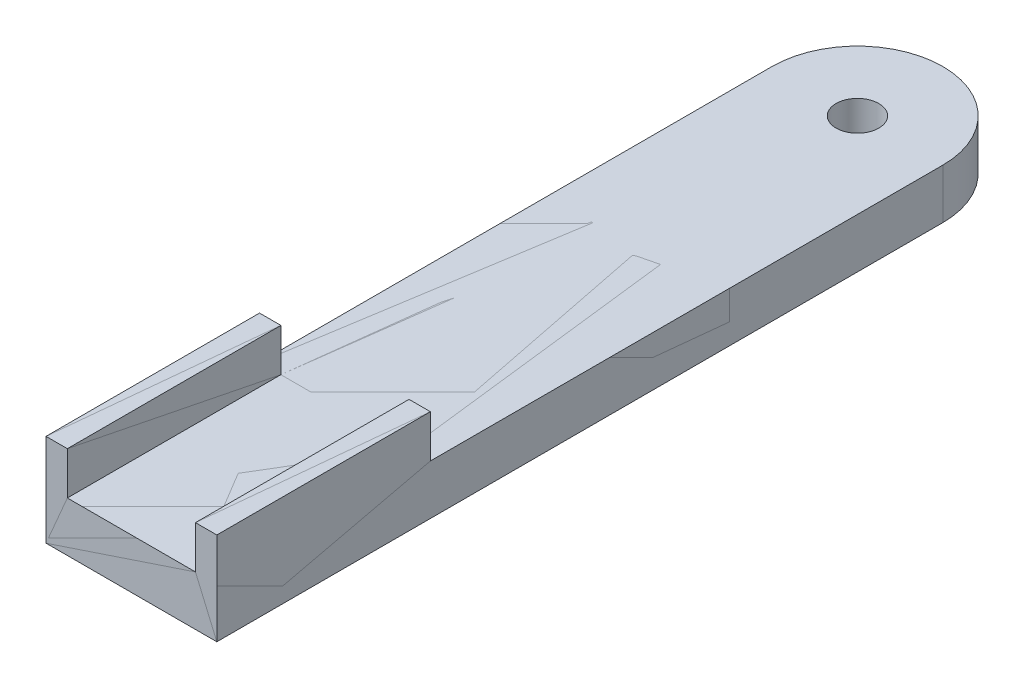
ISO-10303-21;
HEADER;
FILE_DESCRIPTION(('STEP AP214'),'2;1');
FILE_NAME('part.step','',(''),(''),'','','');
FILE_SCHEMA(('AUTOMOTIVE_DESIGN { 1 0 10303 214 1 1 1 1 }'));
ENDSEC;
DATA;
#1=APPLICATION_CONTEXT('core data for automotive mechanical design processes');
#2=APPLICATION_PROTOCOL_DEFINITION('international standard','automotive_design',2000,#1);
#3=PRODUCT_CONTEXT('',#1,'mechanical');
#4=PRODUCT('Part','Part','',(#3));
#5=PRODUCT_RELATED_PRODUCT_CATEGORY('part','',(#4));
#6=PRODUCT_DEFINITION_FORMATION('','',#4);
#7=PRODUCT_DEFINITION_CONTEXT('part definition',#1,'design');
#8=PRODUCT_DEFINITION('design','',#6,#7);
#9=PRODUCT_DEFINITION_SHAPE('','',#8);
#10=(LENGTH_UNIT() NAMED_UNIT(*) SI_UNIT(.MILLI.,.METRE.));
#11=(NAMED_UNIT(*) PLANE_ANGLE_UNIT() SI_UNIT($,.RADIAN.));
#12=(NAMED_UNIT(*) SI_UNIT($,.STERADIAN.) SOLID_ANGLE_UNIT());
#13=UNCERTAINTY_MEASURE_WITH_UNIT(LENGTH_MEASURE(1.E-05),#10,'distance_accuracy_value','');
#14=(GEOMETRIC_REPRESENTATION_CONTEXT(3) GLOBAL_UNCERTAINTY_ASSIGNED_CONTEXT((#13)) GLOBAL_UNIT_ASSIGNED_CONTEXT((#10,
#11,#12)) REPRESENTATION_CONTEXT('',''));
#15=CARTESIAN_POINT('',(0.,0.,0.));
#16=DIRECTION('',(0.,0.,1.));
#17=DIRECTION('',(1.,0.,0.));
#18=AXIS2_PLACEMENT_3D('',#15,#16,#17);
#19=CARTESIAN_POINT('',(0.,0.,-15.0000002235174));
#20=DIRECTION('',(0.,0.,-1.));
#21=DIRECTION('',(-1.,0.,0.));
#22=AXIS2_PLACEMENT_3D('',#19,#20,#21);
#23=PLANE('',#22);
#24=DIRECTION('',(1.,0.,0.));
#25=VECTOR('',#24,1.);
#26=CARTESIAN_POINT('',(12.,3.5,-15.0000002235174));
#27=LINE('',#26,#25);
#28=CARTESIAN_POINT('',(0.,3.5,-15.0000002235174));
#29=VERTEX_POINT('',#28);
#30=CARTESIAN_POINT('',(1.5,3.5,-15.0000002235174));
#31=VERTEX_POINT('',#30);
#32=EDGE_CURVE('P0_E56',#29,#31,#27,.T.);
#33=ORIENTED_EDGE('',*,*,#32,.F.);
#34=DIRECTION('',(0.,1.,0.));
#35=VECTOR('',#34,1.);
#36=CARTESIAN_POINT('',(0.,3.5,-15.0000002235174));
#37=LINE('',#36,#35);
#38=CARTESIAN_POINT('',(0.,6.5,-15.0000002235174));
#39=VERTEX_POINT('',#38);
#40=EDGE_CURVE('P0_E165',#29,#39,#37,.T.);
#41=ORIENTED_EDGE('',*,*,#40,.T.);
#42=DIRECTION('',(-1.,0.,0.));
#43=VECTOR('',#42,1.);
#44=CARTESIAN_POINT('',(0.,6.5,-15.0000002235174));
#45=LINE('',#44,#43);
#46=CARTESIAN_POINT('',(1.5,6.5,-15.0000002235174));
#47=VERTEX_POINT('',#46);
#48=EDGE_CURVE('P0_E161',#47,#39,#45,.T.);
#49=ORIENTED_EDGE('',*,*,#48,.F.);
#50=DIRECTION('',(0.,1.,0.));
#51=VECTOR('',#50,1.);
#52=CARTESIAN_POINT('',(1.5,3.5,-15.0000002235174));
#53=LINE('',#52,#51);
#54=EDGE_CURVE('P0_E166',#31,#47,#53,.T.);
#55=ORIENTED_EDGE('',*,*,#54,.F.);
#56=EDGE_LOOP('',(#33,#41,#49,#55));
#57=FACE_BOUND('',#56,.T.);
#58=ADVANCED_FACE('P0_F44',(#57),#23,.T.);
#59=CARTESIAN_POINT('',(10.5,3.5,-15.0000002235174));
#60=VERTEX_POINT('',#59);
#61=CARTESIAN_POINT('',(12.,3.5,-15.0000002235174));
#62=VERTEX_POINT('',#61);
#63=EDGE_CURVE('P0_E11',#60,#62,#27,.T.);
#64=ORIENTED_EDGE('',*,*,#63,.F.);
#65=DIRECTION('',(0.,1.,0.));
#66=VECTOR('',#65,1.);
#67=CARTESIAN_POINT('',(10.5,3.5,-15.0000002235174));
#68=LINE('',#67,#66);
#69=CARTESIAN_POINT('',(10.5,6.5,-15.0000002235174));
#70=VERTEX_POINT('',#69);
#71=EDGE_CURVE('P0_E197',#60,#70,#68,.T.);
#72=ORIENTED_EDGE('',*,*,#71,.T.);
#73=DIRECTION('',(-1.,0.,0.));
#74=VECTOR('',#73,1.);
#75=CARTESIAN_POINT('',(12.,6.5,-15.0000002235174));
#76=LINE('',#75,#74);
#77=CARTESIAN_POINT('',(12.,6.5,-15.0000002235174));
#78=VERTEX_POINT('',#77);
#79=EDGE_CURVE('P0_E190',#78,#70,#76,.T.);
#80=ORIENTED_EDGE('',*,*,#79,.F.);
#81=DIRECTION('',(0.,1.,0.));
#82=VECTOR('',#81,1.);
#83=CARTESIAN_POINT('',(12.,3.5,-15.0000002235174));
#84=LINE('',#83,#82);
#85=EDGE_CURVE('P0_E186',#62,#78,#84,.T.);
#86=ORIENTED_EDGE('',*,*,#85,.F.);
#87=EDGE_LOOP('',(#64,#72,#80,#86));
#88=FACE_BOUND('',#87,.T.);
#89=ADVANCED_FACE('P0_F268',(#88),#23,.T.);
#90=CARTESIAN_POINT('',(0.,0.,-36.0000005364418));
#91=DIRECTION('',(-1.,0.,0.));
#92=DIRECTION('',(0.,0.,1.));
#93=AXIS2_PLACEMENT_3D('',#90,#91,#92);
#94=PLANE('',#93);
#95=ORIENTED_EDGE('',*,*,#40,.F.);
#96=DIRECTION('',(0.,0.,-1.));
#97=VECTOR('',#96,1.);
#98=CARTESIAN_POINT('',(0.,3.5,0.00199999999999853));
#99=LINE('',#98,#97);
#100=CARTESIAN_POINT('',(0.,3.5,-51.0000005364418));
#101=VERTEX_POINT('',#100);
#102=EDGE_CURVE('P0_E152',#29,#101,#99,.T.);
#103=ORIENTED_EDGE('',*,*,#102,.T.);
#104=DIRECTION('',(0.,1.,0.));
#105=VECTOR('',#104,1.);
#106=CARTESIAN_POINT('',(0.,0.,-51.0000005364418));
#107=LINE('',#106,#105);
#108=CARTESIAN_POINT('',(0.,0.,-51.0000005364418));
#109=VERTEX_POINT('',#108);
#110=EDGE_CURVE('P0_E140',#109,#101,#107,.T.);
#111=ORIENTED_EDGE('',*,*,#110,.F.);
#112=DIRECTION('',(0.,0.,-1.));
#113=VECTOR('',#112,1.);
#114=CARTESIAN_POINT('',(0.,0.,0.));
#115=LINE('',#114,#113);
#116=CARTESIAN_POINT('',(0.,0.,0.));
#117=VERTEX_POINT('',#116);
#118=EDGE_CURVE('P0_E48',#117,#109,#115,.T.);
#119=ORIENTED_EDGE('',*,*,#118,.F.);
#120=DIRECTION('',(0.,1.,0.));
#121=VECTOR('',#120,1.);
#122=CARTESIAN_POINT('',(0.,0.,0.));
#123=LINE('',#122,#121);
#124=CARTESIAN_POINT('',(0.,6.5,0.));
#125=VERTEX_POINT('',#124);
#126=EDGE_CURVE('P0_E172',#117,#125,#123,.T.);
#127=ORIENTED_EDGE('',*,*,#126,.T.);
#128=DIRECTION('',(0.,0.,1.));
#129=VECTOR('',#128,1.);
#130=CARTESIAN_POINT('',(0.,6.5,0.));
#131=LINE('',#130,#129);
#132=EDGE_CURVE('P0_E176',#39,#125,#131,.T.);
#133=ORIENTED_EDGE('',*,*,#132,.F.);
#134=EDGE_LOOP('',(#95,#103,#111,#119,#127,#133));
#135=FACE_BOUND('',#134,.T.);
#136=ADVANCED_FACE('P0_F270',(#135),#94,.T.);
#137=CARTESIAN_POINT('',(0.75,6.5,-7.50000011175871));
#138=DIRECTION('',(0.,1.,0.));
#139=DIRECTION('',(1.,0.,0.));
#140=AXIS2_PLACEMENT_3D('',#137,#138,#139);
#141=PLANE('',#140);
#142=ORIENTED_EDGE('',*,*,#132,.T.);
#143=DIRECTION('',(1.,0.,0.));
#144=VECTOR('',#143,1.);
#145=CARTESIAN_POINT('',(0.,6.5,0.));
#146=LINE('',#145,#144);
#147=CARTESIAN_POINT('',(1.5,6.5,0.));
#148=VERTEX_POINT('',#147);
#149=EDGE_CURVE('P0_E181',#125,#148,#146,.T.);
#150=ORIENTED_EDGE('',*,*,#149,.T.);
#151=DIRECTION('',(0.,0.,-1.));
#152=VECTOR('',#151,1.);
#153=CARTESIAN_POINT('',(1.5,6.5,-15.0000002235174));
#154=LINE('',#153,#152);
#155=EDGE_CURVE('P0_E194',#148,#47,#154,.T.);
#156=ORIENTED_EDGE('',*,*,#155,.T.);
#157=ORIENTED_EDGE('',*,*,#48,.T.);
#158=EDGE_LOOP('',(#142,#150,#156,#157));
#159=FACE_BOUND('',#158,.T.);
#160=ADVANCED_FACE('P0_F278',(#159),#141,.T.);
#161=CARTESIAN_POINT('',(1.5,3.5,0.));
#162=DIRECTION('',(1.,0.,0.));
#163=DIRECTION('',(0.,1.,0.));
#164=AXIS2_PLACEMENT_3D('',#161,#162,#163);
#165=PLANE('',#164);
#166=DIRECTION('',(0.,0.,1.));
#167=VECTOR('',#166,1.);
#168=CARTESIAN_POINT('',(1.5,3.5,-10.5000001341105));
#169=LINE('',#168,#167);
#170=CARTESIAN_POINT('',(1.5,3.5,0.));
#171=VERTEX_POINT('',#170);
#172=EDGE_CURVE('P0_E206',#31,#171,#169,.T.);
#173=ORIENTED_EDGE('',*,*,#172,.F.);
#174=ORIENTED_EDGE('',*,*,#54,.T.);
#175=ORIENTED_EDGE('',*,*,#155,.F.);
#176=DIRECTION('',(0.,1.,0.));
#177=VECTOR('',#176,1.);
#178=CARTESIAN_POINT('',(1.5,3.5,0.));
#179=LINE('',#178,#177);
#180=EDGE_CURVE('P0_E180',#171,#148,#179,.T.);
#181=ORIENTED_EDGE('',*,*,#180,.F.);
#182=EDGE_LOOP('',(#173,#174,#175,#181));
#183=FACE_BOUND('',#182,.T.);
#184=ADVANCED_FACE('P0_F284',(#183),#165,.T.);
#185=CARTESIAN_POINT('',(11.25,6.5,-7.50000011175871));
#186=DIRECTION('',(0.,1.,0.));
#187=DIRECTION('',(1.,0.,0.));
#188=AXIS2_PLACEMENT_3D('',#185,#186,#187);
#189=PLANE('',#188);
#190=ORIENTED_EDGE('',*,*,#79,.T.);
#191=DIRECTION('',(0.,0.,1.));
#192=VECTOR('',#191,1.);
#193=CARTESIAN_POINT('',(10.5,6.5,-15.0000002235174));
#194=LINE('',#193,#192);
#195=CARTESIAN_POINT('',(10.5,6.5,0.));
#196=VERTEX_POINT('',#195);
#197=EDGE_CURVE('P0_E171',#70,#196,#194,.T.);
#198=ORIENTED_EDGE('',*,*,#197,.T.);
#199=DIRECTION('',(1.,0.,0.));
#200=VECTOR('',#199,1.);
#201=CARTESIAN_POINT('',(12.,6.5,0.));
#202=LINE('',#201,#200);
#203=CARTESIAN_POINT('',(12.,6.5,0.));
#204=VERTEX_POINT('',#203);
#205=EDGE_CURVE('P0_E182',#196,#204,#202,.T.);
#206=ORIENTED_EDGE('',*,*,#205,.T.);
#207=DIRECTION('',(0.,0.,-1.));
#208=VECTOR('',#207,1.);
#209=CARTESIAN_POINT('',(12.,6.5,0.));
#210=LINE('',#209,#208);
#211=EDGE_CURVE('P0_E187',#204,#78,#210,.T.);
#212=ORIENTED_EDGE('',*,*,#211,.T.);
#213=EDGE_LOOP('',(#190,#198,#206,#212));
#214=FACE_BOUND('',#213,.T.);
#215=ADVANCED_FACE('P0_F264',(#214),#189,.T.);
#216=CARTESIAN_POINT('',(0.,0.,0.));
#217=DIRECTION('',(0.,0.,1.));
#218=DIRECTION('',(1.,0.,0.));
#219=AXIS2_PLACEMENT_3D('',#216,#217,#218);
#220=PLANE('',#219);
#221=DIRECTION('',(1.,0.,0.));
#222=VECTOR('',#221,1.);
#223=CARTESIAN_POINT('',(0.,0.,0.));
#224=LINE('',#223,#222);
#225=CARTESIAN_POINT('',(12.,0.,0.));
#226=VERTEX_POINT('',#225);
#227=EDGE_CURVE('P0_E160',#117,#226,#224,.T.);
#228=ORIENTED_EDGE('',*,*,#227,.T.);
#229=DIRECTION('',(0.,1.,0.));
#230=VECTOR('',#229,1.);
#231=CARTESIAN_POINT('',(12.,0.,0.));
#232=LINE('',#231,#230);
#233=EDGE_CURVE('P0_E209',#226,#204,#232,.T.);
#234=ORIENTED_EDGE('',*,*,#233,.T.);
#235=ORIENTED_EDGE('',*,*,#205,.F.);
#236=DIRECTION('',(0.,1.,0.));
#237=VECTOR('',#236,1.);
#238=CARTESIAN_POINT('',(10.5,3.5,0.));
#239=LINE('',#238,#237);
#240=CARTESIAN_POINT('',(10.5,3.5,0.));
#241=VERTEX_POINT('',#240);
#242=EDGE_CURVE('P0_E167',#241,#196,#239,.T.);
#243=ORIENTED_EDGE('',*,*,#242,.F.);
#244=DIRECTION('',(1.,0.,0.));
#245=VECTOR('',#244,1.);
#246=CARTESIAN_POINT('',(0.,3.5,0.));
#247=LINE('',#246,#245);
#248=EDGE_CURVE('P0_E70',#171,#241,#247,.T.);
#249=ORIENTED_EDGE('',*,*,#248,.F.);
#250=ORIENTED_EDGE('',*,*,#180,.T.);
#251=ORIENTED_EDGE('',*,*,#149,.F.);
#252=ORIENTED_EDGE('',*,*,#126,.F.);
#253=EDGE_LOOP('',(#228,#234,#235,#243,#249,#250,#251,#252));
#254=FACE_BOUND('',#253,.T.);
#255=ADVANCED_FACE('P0_F257',(#254),#220,.T.);
#256=CARTESIAN_POINT('',(6.,3.5,-21.0000002682209));
#257=DIRECTION('',(0.,1.,0.));
#258=DIRECTION('',(1.,0.,0.));
#259=AXIS2_PLACEMENT_3D('',#256,#257,#258);
#260=PLANE('',#259);
#261=DIRECTION('',(0.,0.,-1.));
#262=VECTOR('',#261,1.);
#263=CARTESIAN_POINT('',(10.5,3.5,-18.0000002458692));
#264=LINE('',#263,#262);
#265=EDGE_CURVE('P0_E54',#241,#60,#264,.T.);
#266=ORIENTED_EDGE('',*,*,#265,.T.);
#267=ORIENTED_EDGE('',*,*,#63,.T.);
#268=DIRECTION('',(0.,0.,-1.));
#269=VECTOR('',#268,1.);
#270=CARTESIAN_POINT('',(12.,3.5,0.00199999999999853));
#271=LINE('',#270,#269);
#272=CARTESIAN_POINT('',(12.,3.5,-51.0000005364418));
#273=VERTEX_POINT('',#272);
#274=EDGE_CURVE('P0_E155',#62,#273,#271,.T.);
#275=ORIENTED_EDGE('',*,*,#274,.T.);
#276=CARTESIAN_POINT('',(6.,3.5,-51.0000005364418));
#277=DIRECTION('',(0.,1.,0.));
#278=DIRECTION('',(1.,0.,0.));
#279=AXIS2_PLACEMENT_3D('',#276,#277,#278);
#280=CIRCLE('',#279,6.);
#281=EDGE_CURVE('P0_E244',#273,#101,#280,.T.);
#282=ORIENTED_EDGE('',*,*,#281,.T.);
#283=ORIENTED_EDGE('',*,*,#102,.F.);
#284=ORIENTED_EDGE('',*,*,#32,.T.);
#285=ORIENTED_EDGE('',*,*,#172,.T.);
#286=ORIENTED_EDGE('',*,*,#248,.T.);
#287=EDGE_LOOP('',(#266,#267,#275,#282,#283,#284,#285,#286));
#288=FACE_BOUND('',#287,.T.);
#289=CARTESIAN_POINT('',(6.,3.5,-51.0000005364418));
#290=DIRECTION('',(0.,-1.,0.));
#291=DIRECTION('',(1.,0.,0.));
#292=AXIS2_PLACEMENT_3D('',#289,#290,#291);
#293=CIRCLE('',#292,1.5);
#294=CARTESIAN_POINT('',(4.5,3.5,-51.0000005364418));
#295=VERTEX_POINT('',#294);
#296=EDGE_CURVE('P0_E147',#295,#295,#293,.T.);
#297=ORIENTED_EDGE('',*,*,#296,.T.);
#298=EDGE_LOOP('',(#297));
#299=FACE_BOUND('',#298,.T.);
#300=ADVANCED_FACE('P0_F46',(#288,#299),#260,.T.);
#301=CARTESIAN_POINT('',(10.5,3.5,-15.0000002235174));
#302=DIRECTION('',(-1.,0.,0.));
#303=DIRECTION('',(0.,0.,1.));
#304=AXIS2_PLACEMENT_3D('',#301,#302,#303);
#305=PLANE('',#304);
#306=ORIENTED_EDGE('',*,*,#265,.F.);
#307=ORIENTED_EDGE('',*,*,#242,.T.);
#308=ORIENTED_EDGE('',*,*,#197,.F.);
#309=ORIENTED_EDGE('',*,*,#71,.F.);
#310=EDGE_LOOP('',(#306,#307,#308,#309));
#311=FACE_BOUND('',#310,.T.);
#312=ADVANCED_FACE('P0_F256',(#311),#305,.T.);
#313=CARTESIAN_POINT('',(6.,0.,-21.0000002682209));
#314=DIRECTION('',(0.,1.,0.));
#315=DIRECTION('',(1.,0.,0.));
#316=AXIS2_PLACEMENT_3D('',#313,#314,#315);
#317=PLANE('',#316);
#318=ORIENTED_EDGE('',*,*,#118,.T.);
#319=CARTESIAN_POINT('',(6.,0.,-51.0000005364418));
#320=DIRECTION('',(0.,1.,0.));
#321=DIRECTION('',(1.,0.,0.));
#322=AXIS2_PLACEMENT_3D('',#319,#320,#321);
#323=CIRCLE('',#322,6.);
#324=CARTESIAN_POINT('',(12.,0.,-51.0000005364418));
#325=VERTEX_POINT('',#324);
#326=EDGE_CURVE('P0_E145',#325,#109,#323,.T.);
#327=ORIENTED_EDGE('',*,*,#326,.F.);
#328=DIRECTION('',(0.,0.,-1.));
#329=VECTOR('',#328,1.);
#330=CARTESIAN_POINT('',(12.,0.,0.));
#331=LINE('',#330,#329);
#332=EDGE_CURVE('P0_E175',#226,#325,#331,.T.);
#333=ORIENTED_EDGE('',*,*,#332,.F.);
#334=ORIENTED_EDGE('',*,*,#227,.F.);
#335=EDGE_LOOP('',(#318,#327,#333,#334));
#336=FACE_BOUND('',#335,.T.);
#337=CARTESIAN_POINT('',(6.,0.,-51.0000005364418));
#338=DIRECTION('',(0.,-1.,0.));
#339=DIRECTION('',(1.,0.,0.));
#340=AXIS2_PLACEMENT_3D('',#337,#338,#339);
#341=CIRCLE('',#340,1.5);
#342=CARTESIAN_POINT('',(4.5,0.,-51.0000005364418));
#343=VERTEX_POINT('',#342);
#344=EDGE_CURVE('P0_E133',#343,#343,#341,.T.);
#345=ORIENTED_EDGE('',*,*,#344,.F.);
#346=EDGE_LOOP('',(#345));
#347=FACE_BOUND('',#346,.T.);
#348=ADVANCED_FACE('P0_F247',(#336,#347),#317,.F.);
#349=CARTESIAN_POINT('',(12.,0.,0.));
#350=DIRECTION('',(1.,0.,0.));
#351=DIRECTION('',(0.,0.,1.));
#352=AXIS2_PLACEMENT_3D('',#349,#350,#351);
#353=PLANE('',#352);
#354=ORIENTED_EDGE('',*,*,#332,.T.);
#355=DIRECTION('',(0.,1.,0.));
#356=VECTOR('',#355,1.);
#357=CARTESIAN_POINT('',(12.,0.,-51.0000005364418));
#358=LINE('',#357,#356);
#359=EDGE_CURVE('P0_E156',#325,#273,#358,.T.);
#360=ORIENTED_EDGE('',*,*,#359,.T.);
#361=ORIENTED_EDGE('',*,*,#274,.F.);
#362=ORIENTED_EDGE('',*,*,#85,.T.);
#363=ORIENTED_EDGE('',*,*,#211,.F.);
#364=ORIENTED_EDGE('',*,*,#233,.F.);
#365=EDGE_LOOP('',(#354,#360,#361,#362,#363,#364));
#366=FACE_BOUND('',#365,.T.);
#367=ADVANCED_FACE('P0_F233',(#366),#353,.T.);
#368=CARTESIAN_POINT('',(6.,0.,-51.0000005364418));
#369=DIRECTION('',(0.,1.,0.));
#370=DIRECTION('',(1.,0.,0.));
#371=AXIS2_PLACEMENT_3D('',#368,#369,#370);
#372=CYLINDRICAL_SURFACE('',#371,1.5);
#373=ORIENTED_EDGE('',*,*,#296,.F.);
#374=DIRECTION('',(0.,-1.,0.));
#375=VECTOR('',#374,1.);
#376=CARTESIAN_POINT('',(4.5,0.,-51.0000005364418));
#377=LINE('',#376,#375);
#378=EDGE_CURVE('P0_E136',#295,#343,#377,.T.);
#379=ORIENTED_EDGE('',*,*,#378,.T.);
#380=ORIENTED_EDGE('',*,*,#344,.T.);
#381=ORIENTED_EDGE('',*,*,#378,.F.);
#382=EDGE_LOOP('',(#373,#379,#380,#381));
#383=FACE_BOUND('',#382,.T.);
#384=ADVANCED_FACE('P0_F135',(#383),#372,.F.);
#385=CARTESIAN_POINT('',(6.,0.,-51.0000005364418));
#386=DIRECTION('',(0.,1.,0.));
#387=DIRECTION('',(1.,0.,0.));
#388=AXIS2_PLACEMENT_3D('',#385,#386,#387);
#389=CYLINDRICAL_SURFACE('',#388,6.);
#390=ORIENTED_EDGE('',*,*,#326,.T.);
#391=ORIENTED_EDGE('',*,*,#110,.T.);
#392=ORIENTED_EDGE('',*,*,#281,.F.);
#393=ORIENTED_EDGE('',*,*,#359,.F.);
#394=EDGE_LOOP('',(#390,#391,#392,#393));
#395=FACE_BOUND('',#394,.T.);
#396=ADVANCED_FACE('P0_F241',(#395),#389,.T.);
#397=CLOSED_SHELL('',(#58,#89,#136,#160,#184,#215,#255,#300,#312,#348,#367,#384,#396));
#398=MANIFOLD_SOLID_BREP('P0_B2',#397);
#399=CARTESIAN_POINT('',(6.,0.,-21.0000002682209));
#400=DIRECTION('',(0.,1.,0.));
#401=DIRECTION('',(1.,0.,0.));
#402=AXIS2_PLACEMENT_3D('',#399,#400,#401);
#403=PLANE('',#402);
#404=CARTESIAN_POINT('',(6.,0.,-36.0000005364418));
#405=DIRECTION('',(0.,-1.,0.));
#406=DIRECTION('',(1.,0.,0.));
#407=AXIS2_PLACEMENT_3D('',#404,#405,#406);
#408=CIRCLE('',#407,1.5);
#409=CARTESIAN_POINT('',(4.5,0.,-36.0000005364418));
#410=VERTEX_POINT('',#409);
#411=EDGE_CURVE('P1_E124',#410,#410,#408,.T.);
#412=ORIENTED_EDGE('',*,*,#411,.F.);
#413=EDGE_LOOP('',(#412));
#414=FACE_BOUND('',#413,.T.);
#415=DIRECTION('',(1.,0.,0.));
#416=VECTOR('',#415,1.);
#417=CARTESIAN_POINT('',(0.,0.,0.));
#418=LINE('',#417,#416);
#419=CARTESIAN_POINT('',(0.,0.,0.));
#420=VERTEX_POINT('',#419);
#421=CARTESIAN_POINT('',(12.,0.,0.));
#422=VERTEX_POINT('',#421);
#423=EDGE_CURVE('P1_E11',#420,#422,#418,.T.);
#424=ORIENTED_EDGE('',*,*,#423,.F.);
#425=DIRECTION('',(0.,0.,-1.));
#426=VECTOR('',#425,1.);
#427=CARTESIAN_POINT('',(0.,0.,0.));
#428=LINE('',#427,#426);
#429=CARTESIAN_POINT('',(0.,0.,-36.0000005364418));
#430=VERTEX_POINT('',#429);
#431=EDGE_CURVE('P1_E106',#420,#430,#428,.T.);
#432=ORIENTED_EDGE('',*,*,#431,.T.);
#433=CARTESIAN_POINT('',(6.,0.,-36.0000005364418));
#434=DIRECTION('',(0.,1.,0.));
#435=DIRECTION('',(1.,0.,0.));
#436=AXIS2_PLACEMENT_3D('',#433,#434,#435);
#437=CIRCLE('',#436,6.);
#438=CARTESIAN_POINT('',(12.,0.,-36.0000005364418));
#439=VERTEX_POINT('',#438);
#440=EDGE_CURVE('P1_E138',#439,#430,#437,.T.);
#441=ORIENTED_EDGE('',*,*,#440,.F.);
#442=DIRECTION('',(0.,0.,-1.));
#443=VECTOR('',#442,1.);
#444=CARTESIAN_POINT('',(12.,0.,0.));
#445=LINE('',#444,#443);
#446=EDGE_CURVE('P1_E107',#422,#439,#445,.T.);
#447=ORIENTED_EDGE('',*,*,#446,.F.);
#448=EDGE_LOOP('',(#424,#432,#441,#447));
#449=FACE_BOUND('',#448,.T.);
#450=ADVANCED_FACE('P1_F16',(#414,#449),#403,.F.);
#451=CARTESIAN_POINT('',(0.,0.,0.));
#452=DIRECTION('',(0.,0.,1.));
#453=DIRECTION('',(1.,0.,0.));
#454=AXIS2_PLACEMENT_3D('',#451,#452,#453);
#455=PLANE('',#454);
#456=ORIENTED_EDGE('',*,*,#423,.T.);
#457=DIRECTION('',(0.,1.,0.));
#458=VECTOR('',#457,1.);
#459=CARTESIAN_POINT('',(12.,0.,0.));
#460=LINE('',#459,#458);
#461=CARTESIAN_POINT('',(12.,6.5,0.));
#462=VERTEX_POINT('',#461);
#463=EDGE_CURVE('P1_E27',#422,#462,#460,.T.);
#464=ORIENTED_EDGE('',*,*,#463,.T.);
#465=DIRECTION('',(1.,0.,0.));
#466=VECTOR('',#465,1.);
#467=CARTESIAN_POINT('',(12.,6.5,0.));
#468=LINE('',#467,#466);
#469=CARTESIAN_POINT('',(10.5,6.5,0.));
#470=VERTEX_POINT('',#469);
#471=EDGE_CURVE('P1_E168',#470,#462,#468,.T.);
#472=ORIENTED_EDGE('',*,*,#471,.F.);
#473=DIRECTION('',(0.,1.,0.));
#474=VECTOR('',#473,1.);
#475=CARTESIAN_POINT('',(10.5,3.5,0.));
#476=LINE('',#475,#474);
#477=CARTESIAN_POINT('',(10.5,3.5,0.));
#478=VERTEX_POINT('',#477);
#479=EDGE_CURVE('P1_E182',#478,#470,#476,.T.);
#480=ORIENTED_EDGE('',*,*,#479,.F.);
#481=DIRECTION('',(1.,0.,0.));
#482=VECTOR('',#481,1.);
#483=CARTESIAN_POINT('',(0.,3.5,0.));
#484=LINE('',#483,#482);
#485=CARTESIAN_POINT('',(1.5,3.5,0.));
#486=VERTEX_POINT('',#485);
#487=EDGE_CURVE('P1_E139',#486,#478,#484,.T.);
#488=ORIENTED_EDGE('',*,*,#487,.F.);
#489=DIRECTION('',(0.,1.,0.));
#490=VECTOR('',#489,1.);
#491=CARTESIAN_POINT('',(1.5,3.5,0.));
#492=LINE('',#491,#490);
#493=CARTESIAN_POINT('',(1.5,6.5,0.));
#494=VERTEX_POINT('',#493);
#495=EDGE_CURVE('P1_E190',#486,#494,#492,.T.);
#496=ORIENTED_EDGE('',*,*,#495,.T.);
#497=DIRECTION('',(1.,0.,0.));
#498=VECTOR('',#497,1.);
#499=CARTESIAN_POINT('',(0.,6.5,0.));
#500=LINE('',#499,#498);
#501=CARTESIAN_POINT('',(0.,6.5,0.));
#502=VERTEX_POINT('',#501);
#503=EDGE_CURVE('P1_E114',#502,#494,#500,.T.);
#504=ORIENTED_EDGE('',*,*,#503,.F.);
#505=DIRECTION('',(0.,1.,0.));
#506=VECTOR('',#505,1.);
#507=CARTESIAN_POINT('',(0.,0.,0.));
#508=LINE('',#507,#506);
#509=EDGE_CURVE('P1_E110',#420,#502,#508,.T.);
#510=ORIENTED_EDGE('',*,*,#509,.F.);
#511=EDGE_LOOP('',(#456,#464,#472,#480,#488,#496,#504,#510));
#512=FACE_BOUND('',#511,.T.);
#513=ADVANCED_FACE('P1_F111',(#512),#455,.T.);
#514=CARTESIAN_POINT('',(12.,0.,0.));
#515=DIRECTION('',(1.,0.,0.));
#516=DIRECTION('',(0.,0.,1.));
#517=AXIS2_PLACEMENT_3D('',#514,#515,#516);
#518=PLANE('',#517);
#519=ORIENTED_EDGE('',*,*,#446,.T.);
#520=DIRECTION('',(0.,1.,0.));
#521=VECTOR('',#520,1.);
#522=CARTESIAN_POINT('',(12.,0.,-36.0000005364418));
#523=LINE('',#522,#521);
#524=CARTESIAN_POINT('',(12.,3.5,-36.0000005364418));
#525=VERTEX_POINT('',#524);
#526=EDGE_CURVE('P1_E152',#439,#525,#523,.T.);
#527=ORIENTED_EDGE('',*,*,#526,.T.);
#528=DIRECTION('',(0.,0.,-1.));
#529=VECTOR('',#528,1.);
#530=CARTESIAN_POINT('',(12.,3.5,0.));
#531=LINE('',#530,#529);
#532=CARTESIAN_POINT('',(12.,3.5,-15.0000002235174));
#533=VERTEX_POINT('',#532);
#534=EDGE_CURVE('P1_E153',#533,#525,#531,.T.);
#535=ORIENTED_EDGE('',*,*,#534,.F.);
#536=DIRECTION('',(0.,1.,0.));
#537=VECTOR('',#536,1.);
#538=CARTESIAN_POINT('',(12.,3.5,-15.0000002235174));
#539=LINE('',#538,#537);
#540=CARTESIAN_POINT('',(12.,6.5,-15.0000002235174));
#541=VERTEX_POINT('',#540);
#542=EDGE_CURVE('P1_E186',#533,#541,#539,.T.);
#543=ORIENTED_EDGE('',*,*,#542,.T.);
#544=DIRECTION('',(0.,0.,-1.));
#545=VECTOR('',#544,1.);
#546=CARTESIAN_POINT('',(12.,6.5,0.));
#547=LINE('',#546,#545);
#548=EDGE_CURVE('P1_E158',#462,#541,#547,.T.);
#549=ORIENTED_EDGE('',*,*,#548,.F.);
#550=ORIENTED_EDGE('',*,*,#463,.F.);
#551=EDGE_LOOP('',(#519,#527,#535,#543,#549,#550));
#552=FACE_BOUND('',#551,.T.);
#553=ADVANCED_FACE('P1_F232',(#552),#518,.T.);
#554=CARTESIAN_POINT('',(6.,0.,-36.0000005364418));
#555=DIRECTION('',(0.,1.,0.));
#556=DIRECTION('',(1.,0.,0.));
#557=AXIS2_PLACEMENT_3D('',#554,#555,#556);
#558=CYLINDRICAL_SURFACE('',#557,6.);
#559=ORIENTED_EDGE('',*,*,#440,.T.);
#560=DIRECTION('',(0.,1.,0.));
#561=VECTOR('',#560,1.);
#562=CARTESIAN_POINT('',(0.,0.,-36.0000005364418));
#563=LINE('',#562,#561);
#564=CARTESIAN_POINT('',(0.,3.5,-36.0000005364418));
#565=VERTEX_POINT('',#564);
#566=EDGE_CURVE('P1_E118',#430,#565,#563,.T.);
#567=ORIENTED_EDGE('',*,*,#566,.T.);
#568=CARTESIAN_POINT('',(6.,3.5,-36.0000005364418));
#569=DIRECTION('',(0.,1.,0.));
#570=DIRECTION('',(1.,0.,0.));
#571=AXIS2_PLACEMENT_3D('',#568,#569,#570);
#572=CIRCLE('',#571,6.);
#573=EDGE_CURVE('P1_E157',#525,#565,#572,.T.);
#574=ORIENTED_EDGE('',*,*,#573,.F.);
#575=ORIENTED_EDGE('',*,*,#526,.F.);
#576=EDGE_LOOP('',(#559,#567,#574,#575));
#577=FACE_BOUND('',#576,.T.);
#578=ADVANCED_FACE('P1_F235',(#577),#558,.T.);
#579=CARTESIAN_POINT('',(0.,0.,-36.0000005364418));
#580=DIRECTION('',(-1.,0.,0.));
#581=DIRECTION('',(0.,0.,1.));
#582=AXIS2_PLACEMENT_3D('',#579,#580,#581);
#583=PLANE('',#582);
#584=ORIENTED_EDGE('',*,*,#431,.F.);
#585=ORIENTED_EDGE('',*,*,#509,.T.);
#586=DIRECTION('',(0.,0.,1.));
#587=VECTOR('',#586,1.);
#588=CARTESIAN_POINT('',(0.,6.5,0.));
#589=LINE('',#588,#587);
#590=CARTESIAN_POINT('',(0.,6.5,-15.0000002235174));
#591=VERTEX_POINT('',#590);
#592=EDGE_CURVE('P1_E193',#591,#502,#589,.T.);
#593=ORIENTED_EDGE('',*,*,#592,.F.);
#594=DIRECTION('',(0.,1.,0.));
#595=VECTOR('',#594,1.);
#596=CARTESIAN_POINT('',(0.,3.5,-15.0000002235174));
#597=LINE('',#596,#595);
#598=CARTESIAN_POINT('',(0.,3.5,-15.0000002235174));
#599=VERTEX_POINT('',#598);
#600=EDGE_CURVE('P1_E172',#599,#591,#597,.T.);
#601=ORIENTED_EDGE('',*,*,#600,.F.);
#602=DIRECTION('',(0.,0.,1.));
#603=VECTOR('',#602,1.);
#604=CARTESIAN_POINT('',(0.,3.5,0.));
#605=LINE('',#604,#603);
#606=EDGE_CURVE('P1_E161',#565,#599,#605,.T.);
#607=ORIENTED_EDGE('',*,*,#606,.F.);
#608=ORIENTED_EDGE('',*,*,#566,.F.);
#609=EDGE_LOOP('',(#584,#585,#593,#601,#607,#608));
#610=FACE_BOUND('',#609,.T.);
#611=ADVANCED_FACE('P1_F121',(#610),#583,.T.);
#612=CARTESIAN_POINT('',(6.,0.,-36.0000005364418));
#613=DIRECTION('',(0.,1.,0.));
#614=DIRECTION('',(1.,0.,0.));
#615=AXIS2_PLACEMENT_3D('',#612,#613,#614);
#616=CYLINDRICAL_SURFACE('',#615,1.5);
#617=CARTESIAN_POINT('',(6.,3.5,-36.0000005364418));
#618=DIRECTION('',(0.,-1.,0.));
#619=DIRECTION('',(1.,0.,0.));
#620=AXIS2_PLACEMENT_3D('',#617,#618,#619);
#621=CIRCLE('',#620,1.5);
#622=CARTESIAN_POINT('',(4.5,3.5,-36.0000005364418));
#623=VERTEX_POINT('',#622);
#624=EDGE_CURVE('P1_E143',#623,#623,#621,.T.);
#625=ORIENTED_EDGE('',*,*,#624,.F.);
#626=DIRECTION('',(0.,-1.,0.));
#627=VECTOR('',#626,1.);
#628=CARTESIAN_POINT('',(4.5,0.,-36.0000005364418));
#629=LINE('',#628,#627);
#630=EDGE_CURVE('P1_E130',#623,#410,#629,.T.);
#631=ORIENTED_EDGE('',*,*,#630,.T.);
#632=ORIENTED_EDGE('',*,*,#411,.T.);
#633=ORIENTED_EDGE('',*,*,#630,.F.);
#634=EDGE_LOOP('',(#625,#631,#632,#633));
#635=FACE_BOUND('',#634,.T.);
#636=ADVANCED_FACE('P1_F319',(#635),#616,.F.);
#637=CARTESIAN_POINT('',(0.75,6.5,-7.50000011175871));
#638=DIRECTION('',(0.,1.,0.));
#639=DIRECTION('',(1.,0.,0.));
#640=AXIS2_PLACEMENT_3D('',#637,#638,#639);
#641=PLANE('',#640);
#642=ORIENTED_EDGE('',*,*,#592,.T.);
#643=ORIENTED_EDGE('',*,*,#503,.T.);
#644=DIRECTION('',(0.,0.,-1.));
#645=VECTOR('',#644,1.);
#646=CARTESIAN_POINT('',(1.5,6.5,-15.0000002235174));
#647=LINE('',#646,#645);
#648=CARTESIAN_POINT('',(1.5,6.5,-15.0000002235174));
#649=VERTEX_POINT('',#648);
#650=EDGE_CURVE('P1_E134',#494,#649,#647,.T.);
#651=ORIENTED_EDGE('',*,*,#650,.T.);
#652=DIRECTION('',(-1.,0.,0.));
#653=VECTOR('',#652,1.);
#654=CARTESIAN_POINT('',(0.,6.5,-15.0000002235174));
#655=LINE('',#654,#653);
#656=EDGE_CURVE('P1_E177',#649,#591,#655,.T.);
#657=ORIENTED_EDGE('',*,*,#656,.T.);
#658=EDGE_LOOP('',(#642,#643,#651,#657));
#659=FACE_BOUND('',#658,.T.);
#660=ADVANCED_FACE('P1_F281',(#659),#641,.T.);
#661=CARTESIAN_POINT('',(1.5,3.5,0.));
#662=DIRECTION('',(1.,0.,0.));
#663=DIRECTION('',(0.,1.,0.));
#664=AXIS2_PLACEMENT_3D('',#661,#662,#663);
#665=PLANE('',#664);
#666=DIRECTION('',(0.,0.,1.));
#667=VECTOR('',#666,1.);
#668=CARTESIAN_POINT('',(1.5,3.5,-10.5000001341105));
#669=LINE('',#668,#667);
#670=CARTESIAN_POINT('',(1.5,3.5,-15.0000002235174));
#671=VERTEX_POINT('',#670);
#672=EDGE_CURVE('P1_E144',#671,#486,#669,.T.);
#673=ORIENTED_EDGE('',*,*,#672,.F.);
#674=DIRECTION('',(0.,1.,0.));
#675=VECTOR('',#674,1.);
#676=CARTESIAN_POINT('',(1.5,3.5,-15.0000002235174));
#677=LINE('',#676,#675);
#678=EDGE_CURVE('P1_E173',#671,#649,#677,.T.);
#679=ORIENTED_EDGE('',*,*,#678,.T.);
#680=ORIENTED_EDGE('',*,*,#650,.F.);
#681=ORIENTED_EDGE('',*,*,#495,.F.);
#682=EDGE_LOOP('',(#673,#679,#680,#681));
#683=FACE_BOUND('',#682,.T.);
#684=ADVANCED_FACE('P1_F261',(#683),#665,.T.);
#685=CARTESIAN_POINT('',(1.5,3.5,-15.0000002235174));
#686=DIRECTION('',(0.,0.,-1.));
#687=DIRECTION('',(0.,-1.,0.));
#688=AXIS2_PLACEMENT_3D('',#685,#686,#687);
#689=PLANE('',#688);
#690=DIRECTION('',(1.,0.,0.));
#691=VECTOR('',#690,1.);
#692=CARTESIAN_POINT('',(3.75,3.5,-15.0000002235174));
#693=LINE('',#692,#691);
#694=EDGE_CURVE('P1_E164',#599,#671,#693,.T.);
#695=ORIENTED_EDGE('',*,*,#694,.F.);
#696=ORIENTED_EDGE('',*,*,#600,.T.);
#697=ORIENTED_EDGE('',*,*,#656,.F.);
#698=ORIENTED_EDGE('',*,*,#678,.F.);
#699=EDGE_LOOP('',(#695,#696,#697,#698));
#700=FACE_BOUND('',#699,.T.);
#701=ADVANCED_FACE('P1_F326',(#700),#689,.T.);
#702=CARTESIAN_POINT('',(6.,3.5,-21.0000002682209));
#703=DIRECTION('',(0.,1.,0.));
#704=DIRECTION('',(1.,0.,0.));
#705=AXIS2_PLACEMENT_3D('',#702,#703,#704);
#706=PLANE('',#705);
#707=ORIENTED_EDGE('',*,*,#624,.T.);
#708=EDGE_LOOP('',(#707));
#709=FACE_BOUND('',#708,.T.);
#710=DIRECTION('',(0.,0.,-1.));
#711=VECTOR('',#710,1.);
#712=CARTESIAN_POINT('',(10.5,3.5,-18.0000002458692));
#713=LINE('',#712,#711);
#714=CARTESIAN_POINT('',(10.5,3.5,-15.0000002235174));
#715=VERTEX_POINT('',#714);
#716=EDGE_CURVE('P1_E178',#478,#715,#713,.T.);
#717=ORIENTED_EDGE('',*,*,#716,.T.);
#718=DIRECTION('',(1.,0.,0.));
#719=VECTOR('',#718,1.);
#720=CARTESIAN_POINT('',(9.,3.5,-15.0000002235174));
#721=LINE('',#720,#719);
#722=EDGE_CURVE('P1_E20',#715,#533,#721,.T.);
#723=ORIENTED_EDGE('',*,*,#722,.T.);
#724=ORIENTED_EDGE('',*,*,#534,.T.);
#725=ORIENTED_EDGE('',*,*,#573,.T.);
#726=ORIENTED_EDGE('',*,*,#606,.T.);
#727=ORIENTED_EDGE('',*,*,#694,.T.);
#728=ORIENTED_EDGE('',*,*,#672,.T.);
#729=ORIENTED_EDGE('',*,*,#487,.T.);
#730=EDGE_LOOP('',(#717,#723,#724,#725,#726,#727,#728,#729));
#731=FACE_BOUND('',#730,.T.);
#732=ADVANCED_FACE('P1_F238',(#709,#731),#706,.T.);
#733=CARTESIAN_POINT('',(11.25,6.5,-7.50000011175871));
#734=DIRECTION('',(0.,1.,0.));
#735=DIRECTION('',(1.,0.,0.));
#736=AXIS2_PLACEMENT_3D('',#733,#734,#735);
#737=PLANE('',#736);
#738=DIRECTION('',(-1.,0.,0.));
#739=VECTOR('',#738,1.);
#740=CARTESIAN_POINT('',(12.,6.5,-15.0000002235174));
#741=LINE('',#740,#739);
#742=CARTESIAN_POINT('',(10.5,6.5,-15.0000002235174));
#743=VERTEX_POINT('',#742);
#744=EDGE_CURVE('P1_E183',#541,#743,#741,.T.);
#745=ORIENTED_EDGE('',*,*,#744,.T.);
#746=DIRECTION('',(0.,0.,1.));
#747=VECTOR('',#746,1.);
#748=CARTESIAN_POINT('',(10.5,6.5,-15.0000002235174));
#749=LINE('',#748,#747);
#750=EDGE_CURVE('P1_E204',#743,#470,#749,.T.);
#751=ORIENTED_EDGE('',*,*,#750,.T.);
#752=ORIENTED_EDGE('',*,*,#471,.T.);
#753=ORIENTED_EDGE('',*,*,#548,.T.);
#754=EDGE_LOOP('',(#745,#751,#752,#753));
#755=FACE_BOUND('',#754,.T.);
#756=ADVANCED_FACE('P1_F268',(#755),#737,.T.);
#757=CARTESIAN_POINT('',(12.,3.5,-15.0000002235174));
#758=DIRECTION('',(0.,0.,-1.));
#759=DIRECTION('',(0.,-1.,0.));
#760=AXIS2_PLACEMENT_3D('',#757,#758,#759);
#761=PLANE('',#760);
#762=ORIENTED_EDGE('',*,*,#722,.F.);
#763=DIRECTION('',(0.,1.,0.));
#764=VECTOR('',#763,1.);
#765=CARTESIAN_POINT('',(10.5,3.5,-15.0000002235174));
#766=LINE('',#765,#764);
#767=EDGE_CURVE('P1_E243',#715,#743,#766,.T.);
#768=ORIENTED_EDGE('',*,*,#767,.T.);
#769=ORIENTED_EDGE('',*,*,#744,.F.);
#770=ORIENTED_EDGE('',*,*,#542,.F.);
#771=EDGE_LOOP('',(#762,#768,#769,#770));
#772=FACE_BOUND('',#771,.T.);
#773=ADVANCED_FACE('P1_F270',(#772),#761,.T.);
#774=CARTESIAN_POINT('',(10.5,3.5,-15.0000002235174));
#775=DIRECTION('',(-1.,0.,0.));
#776=DIRECTION('',(0.,0.,1.));
#777=AXIS2_PLACEMENT_3D('',#774,#775,#776);
#778=PLANE('',#777);
#779=ORIENTED_EDGE('',*,*,#716,.F.);
#780=ORIENTED_EDGE('',*,*,#479,.T.);
#781=ORIENTED_EDGE('',*,*,#750,.F.);
#782=ORIENTED_EDGE('',*,*,#767,.F.);
#783=EDGE_LOOP('',(#779,#780,#781,#782));
#784=FACE_BOUND('',#783,.T.);
#785=ADVANCED_FACE('P1_F18',(#784),#778,.T.);
#786=CLOSED_SHELL('',(#450,#513,#553,#578,#611,#636,#660,#684,#701,#732,#756,#773,#785));
#787=MANIFOLD_SOLID_BREP('P1_B1',#786);
#788=ADVANCED_BREP_SHAPE_REPRESENTATION('',(#18,#398,#787),#14);
#789=SHAPE_DEFINITION_REPRESENTATION(#9,#788);
ENDSEC;
END-ISO-10303-21;
